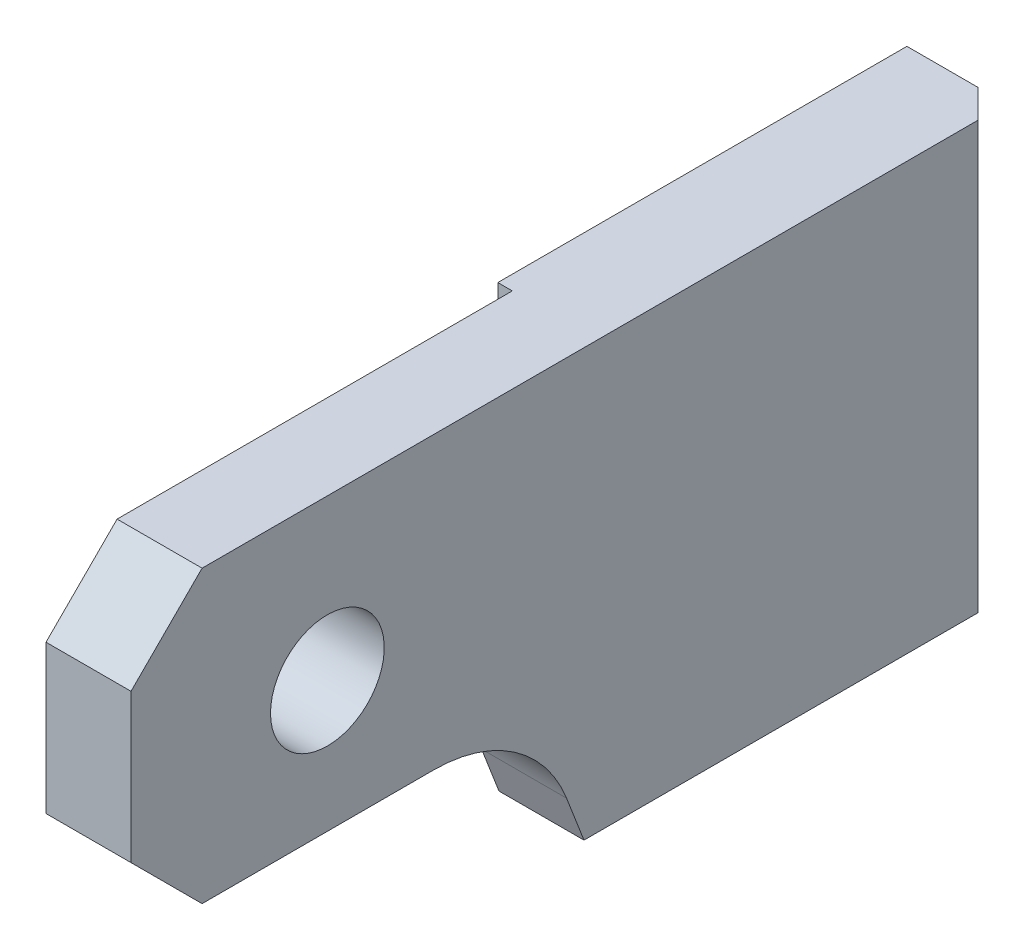
ISO-10303-21;
HEADER;
FILE_DESCRIPTION(('STEP AP214'),'2;1');
FILE_NAME('part.step','',(''),(''),'','','');
FILE_SCHEMA(('AUTOMOTIVE_DESIGN { 1 0 10303 214 1 1 1 1 }'));
ENDSEC;
DATA;
#1=APPLICATION_CONTEXT('core data for automotive mechanical design processes');
#2=APPLICATION_PROTOCOL_DEFINITION('international standard','automotive_design',2000,#1);
#3=PRODUCT_CONTEXT('',#1,'mechanical');
#4=PRODUCT('Part','Part','',(#3));
#5=PRODUCT_RELATED_PRODUCT_CATEGORY('part','',(#4));
#6=PRODUCT_DEFINITION_FORMATION('','',#4);
#7=PRODUCT_DEFINITION_CONTEXT('part definition',#1,'design');
#8=PRODUCT_DEFINITION('design','',#6,#7);
#9=PRODUCT_DEFINITION_SHAPE('','',#8);
#10=(LENGTH_UNIT() NAMED_UNIT(*) SI_UNIT(.MILLI.,.METRE.));
#11=(NAMED_UNIT(*) PLANE_ANGLE_UNIT() SI_UNIT($,.RADIAN.));
#12=(NAMED_UNIT(*) SI_UNIT($,.STERADIAN.) SOLID_ANGLE_UNIT());
#13=UNCERTAINTY_MEASURE_WITH_UNIT(LENGTH_MEASURE(1.E-05),#10,'distance_accuracy_value','');
#14=(GEOMETRIC_REPRESENTATION_CONTEXT(3) GLOBAL_UNCERTAINTY_ASSIGNED_CONTEXT((#13)) GLOBAL_UNIT_ASSIGNED_CONTEXT((#10,
#11,#12)) REPRESENTATION_CONTEXT('',''));
#15=CARTESIAN_POINT('',(0.,0.,0.));
#16=DIRECTION('',(0.,0.,1.));
#17=DIRECTION('',(1.,0.,0.));
#18=AXIS2_PLACEMENT_3D('',#15,#16,#17);
#19=CARTESIAN_POINT('',(-7.,-0.888409732677494,-92.5393309223954));
#20=DIRECTION('',(0.,0.,-1.));
#21=DIRECTION('',(-1.,0.,0.));
#22=AXIS2_PLACEMENT_3D('',#19,#20,#21);
#23=PLANE('',#22);
#24=DIRECTION('',(1.,0.,0.));
#25=VECTOR('',#24,1.);
#26=CARTESIAN_POINT('',(-7.,-0.888409732677494,-92.5393309223954));
#27=LINE('',#26,#25);
#28=CARTESIAN_POINT('',(-7.,-0.888409732677494,-92.5393309223954));
#29=VERTEX_POINT('',#28);
#30=CARTESIAN_POINT('',(-2.00000000000001,-0.888409732677494,-92.5393309223954));
#31=VERTEX_POINT('',#30);
#32=EDGE_CURVE('E173',#29,#31,#27,.T.);
#33=ORIENTED_EDGE('',*,*,#32,.T.);
#34=DIRECTION('',(0.,-1.,0.));
#35=VECTOR('',#34,1.);
#36=CARTESIAN_POINT('',(-2.00000000000001,-30.896809381829,-92.5393309223954));
#37=LINE('',#36,#35);
#38=CARTESIAN_POINT('',(-2.,-30.896809381829,-92.5393309223954));
#39=VERTEX_POINT('',#38);
#40=EDGE_CURVE('E54',#31,#39,#37,.T.);
#41=ORIENTED_EDGE('',*,*,#40,.T.);
#42=DIRECTION('',(1.,0.,0.));
#43=VECTOR('',#42,1.);
#44=CARTESIAN_POINT('',(-7.,-30.896809381829,-92.5393309223954));
#45=LINE('',#44,#43);
#46=CARTESIAN_POINT('',(-7.,-30.896809381829,-92.5393309223954));
#47=VERTEX_POINT('',#46);
#48=EDGE_CURVE('E187',#47,#39,#45,.T.);
#49=ORIENTED_EDGE('',*,*,#48,.F.);
#50=DIRECTION('',(0.,1.,0.));
#51=VECTOR('',#50,1.);
#52=CARTESIAN_POINT('',(-7.,-0.888409732677494,-92.5393309223954));
#53=LINE('',#52,#51);
#54=EDGE_CURVE('E164',#47,#29,#53,.T.);
#55=ORIENTED_EDGE('',*,*,#54,.T.);
#56=EDGE_LOOP('',(#33,#41,#49,#55));
#57=FACE_BOUND('',#56,.T.);
#58=ADVANCED_FACE('F31',(#57),#23,.T.);
#59=CARTESIAN_POINT('',(-7.,-30.8913234542866,-62.8226559338242));
#60=DIRECTION('',(0.,-0.999999982959996,0.00018460771439066));
#61=DIRECTION('',(0.,-0.00018460771439066,-0.999999982959996));
#62=AXIS2_PLACEMENT_3D('',#59,#60,#61);
#63=PLANE('',#62);
#64=DIRECTION('',(0.,0.000184607714390677,0.999999982959996));
#65=VECTOR('',#64,1.);
#66=CARTESIAN_POINT('',(-5.98,-30.8849793695061,-28.4574361847685));
#67=LINE('',#66,#65);
#68=CARTESIAN_POINT('',(-5.98,-30.8914953955952,-63.7540433690182));
#69=VERTEX_POINT('',#68);
#70=CARTESIAN_POINT('',(-5.98,-30.8913234542866,-62.8226559338242));
#71=VERTEX_POINT('',#70);
#72=EDGE_CURVE('E130',#69,#71,#67,.T.);
#73=ORIENTED_EDGE('',*,*,#72,.F.);
#74=DIRECTION('',(1.,0.,0.));
#75=VECTOR('',#74,1.);
#76=CARTESIAN_POINT('',(-13.2889218482286,-30.8914953955952,-63.7540433690182));
#77=LINE('',#76,#75);
#78=CARTESIAN_POINT('',(-7.,-30.8914953955952,-63.7540433690182));
#79=VERTEX_POINT('',#78);
#80=EDGE_CURVE('E121',#79,#69,#77,.T.);
#81=ORIENTED_EDGE('',*,*,#80,.F.);
#82=DIRECTION('',(0.,-0.00018460771439066,-0.999999982959996));
#83=VECTOR('',#82,1.);
#84=CARTESIAN_POINT('',(-7.,-30.8913234542866,-62.8226559338242));
#85=LINE('',#84,#83);
#86=EDGE_CURVE('E171',#79,#47,#85,.T.);
#87=ORIENTED_EDGE('',*,*,#86,.T.);
#88=ORIENTED_EDGE('',*,*,#48,.T.);
#89=DIRECTION('',(0.707106775161997,0.000130537367817163,0.707106775161995));
#90=VECTOR('',#89,1.);
#91=CARTESIAN_POINT('',(10.3583377900718,-30.8945279372971,-80.1809931323237));
#92=LINE('',#91,#90);
#93=CARTESIAN_POINT('',(0.,-30.896440166394,-90.5393309223954));
#94=VERTEX_POINT('',#93);
#95=EDGE_CURVE('E39',#39,#94,#92,.T.);
#96=ORIENTED_EDGE('',*,*,#95,.T.);
#97=DIRECTION('',(0.,-0.00018460771439066,-0.999999982959996));
#98=VECTOR('',#97,1.);
#99=CARTESIAN_POINT('',(0.,-30.8913234542866,-62.8226559338242));
#100=LINE('',#99,#98);
#101=CARTESIAN_POINT('',(0.,-30.8913234542866,-62.8226559338242));
#102=VERTEX_POINT('',#101);
#103=EDGE_CURVE('E168',#102,#94,#100,.T.);
#104=ORIENTED_EDGE('',*,*,#103,.F.);
#105=DIRECTION('',(1.,0.,0.));
#106=VECTOR('',#105,1.);
#107=CARTESIAN_POINT('',(-7.,-30.8913234542866,-62.8226559338242));
#108=LINE('',#107,#106);
#109=EDGE_CURVE('E142',#71,#102,#108,.T.);
#110=ORIENTED_EDGE('',*,*,#109,.F.);
#111=EDGE_LOOP('',(#73,#81,#87,#88,#96,#104,#110));
#112=FACE_BOUND('',#111,.T.);
#113=ADVANCED_FACE('F140',(#112),#63,.T.);
#114=CARTESIAN_POINT('',(-7.,-30.8913234542866,-62.8226559338242));
#115=DIRECTION('',(0.,-0.361043997924807,0.932548782403619));
#116=DIRECTION('',(0.,-0.932548782403619,-0.361043997924807));
#117=AXIS2_PLACEMENT_3D('',#114,#115,#116);
#118=PLANE('',#117);
#119=DIRECTION('',(0.,0.932548782403619,0.361043997924807));
#120=VECTOR('',#119,1.);
#121=CARTESIAN_POINT('',(-5.98,-30.8913234542866,-62.8226559338242));
#122=LINE('',#121,#120);
#123=CARTESIAN_POINT('',(-5.98,-27.7172435022713,-61.593784546898));
#124=VERTEX_POINT('',#123);
#125=EDGE_CURVE('E156',#71,#124,#122,.T.);
#126=ORIENTED_EDGE('',*,*,#125,.F.);
#127=ORIENTED_EDGE('',*,*,#109,.T.);
#128=DIRECTION('',(0.,-0.932548782403619,-0.361043997924807));
#129=VECTOR('',#128,1.);
#130=CARTESIAN_POINT('',(0.,-30.8913234542866,-62.8226559338242));
#131=LINE('',#130,#129);
#132=CARTESIAN_POINT('',(0.,-27.7172435022713,-61.593784546898));
#133=VERTEX_POINT('',#132);
#134=EDGE_CURVE('E182',#133,#102,#131,.T.);
#135=ORIENTED_EDGE('',*,*,#134,.F.);
#136=DIRECTION('',(1.,0.,0.));
#137=VECTOR('',#136,1.);
#138=CARTESIAN_POINT('',(-7.,-27.7172435022713,-61.593784546898));
#139=LINE('',#138,#137);
#140=EDGE_CURVE('E193',#133,#124,#139,.F.);
#141=ORIENTED_EDGE('',*,*,#140,.T.);
#142=EDGE_LOOP('',(#126,#127,#135,#141));
#143=FACE_BOUND('',#142,.T.);
#144=ADVANCED_FACE('F236',(#143),#118,.T.);
#145=CARTESIAN_POINT('',(-7.,-21.3276834815193,-59.1200133743844));
#146=DIRECTION('',(0.,-1.,0.));
#147=DIRECTION('',(0.,0.,-1.));
#148=AXIS2_PLACEMENT_3D('',#145,#146,#147);
#149=PLANE('',#148);
#150=DIRECTION('',(0.,0.,1.));
#151=VECTOR('',#150,1.);
#152=CARTESIAN_POINT('',(-5.98,-21.3276834815193,-59.1200133743844));
#153=LINE('',#152,#151);
#154=CARTESIAN_POINT('',(-5.98,-21.3276834815193,-52.2682967228618));
#155=VERTEX_POINT('',#154);
#156=CARTESIAN_POINT('',(-5.98,-21.3276834815193,-35.9567314021821));
#157=VERTEX_POINT('',#156);
#158=EDGE_CURVE('E46',#155,#157,#153,.T.);
#159=ORIENTED_EDGE('',*,*,#158,.F.);
#160=DIRECTION('',(1.,0.,0.));
#161=VECTOR('',#160,1.);
#162=CARTESIAN_POINT('',(0.,-21.3276834815193,-52.2682967228618));
#163=LINE('',#162,#161);
#164=CARTESIAN_POINT('',(0.,-21.3276834815193,-52.2682967228618));
#165=VERTEX_POINT('',#164);
#166=EDGE_CURVE('E189',#155,#165,#163,.T.);
#167=ORIENTED_EDGE('',*,*,#166,.T.);
#168=DIRECTION('',(0.,0.,-1.));
#169=VECTOR('',#168,1.);
#170=CARTESIAN_POINT('',(0.,-21.3276834815193,-59.1200133743844));
#171=LINE('',#170,#169);
#172=CARTESIAN_POINT('',(0.,-21.3276834815193,-35.9567314021821));
#173=VERTEX_POINT('',#172);
#174=EDGE_CURVE('E179',#173,#165,#171,.T.);
#175=ORIENTED_EDGE('',*,*,#174,.F.);
#176=DIRECTION('',(-1.,0.,0.));
#177=VECTOR('',#176,1.);
#178=CARTESIAN_POINT('',(-7.,-21.3276834815193,-35.9567314021821));
#179=LINE('',#178,#177);
#180=EDGE_CURVE('E209',#173,#157,#179,.T.);
#181=ORIENTED_EDGE('',*,*,#180,.T.);
#182=EDGE_LOOP('',(#159,#167,#175,#181));
#183=FACE_BOUND('',#182,.T.);
#184=ADVANCED_FACE('F263',(#183),#149,.T.);
#185=CARTESIAN_POINT('',(-7.,-0.888409732677494,-30.9567314021821));
#186=DIRECTION('',(0.,0.,1.));
#187=DIRECTION('',(1.,0.,0.));
#188=AXIS2_PLACEMENT_3D('',#185,#186,#187);
#189=PLANE('',#188);
#190=DIRECTION('',(0.,1.,0.));
#191=VECTOR('',#190,1.);
#192=CARTESIAN_POINT('',(-5.98,-0.888409732677494,-30.9567314021821));
#193=LINE('',#192,#191);
#194=CARTESIAN_POINT('',(-5.98,-16.3276834815193,-30.9567314021821));
#195=VERTEX_POINT('',#194);
#196=CARTESIAN_POINT('',(-5.98,-5.8884097326775,-30.9567314021821));
#197=VERTEX_POINT('',#196);
#198=EDGE_CURVE('E147',#195,#197,#193,.T.);
#199=ORIENTED_EDGE('',*,*,#198,.F.);
#200=DIRECTION('',(1.,0.,0.));
#201=VECTOR('',#200,1.);
#202=CARTESIAN_POINT('',(-7.,-16.3276834815193,-30.9567314021821));
#203=LINE('',#202,#201);
#204=CARTESIAN_POINT('',(0.,-16.3276834815193,-30.9567314021821));
#205=VERTEX_POINT('',#204);
#206=EDGE_CURVE('E204',#195,#205,#203,.T.);
#207=ORIENTED_EDGE('',*,*,#206,.T.);
#208=DIRECTION('',(0.,-1.,0.));
#209=VECTOR('',#208,1.);
#210=CARTESIAN_POINT('',(0.,-0.888409732677494,-30.9567314021821));
#211=LINE('',#210,#209);
#212=CARTESIAN_POINT('',(0.,-5.8884097326775,-30.9567314021821));
#213=VERTEX_POINT('',#212);
#214=EDGE_CURVE('E176',#213,#205,#211,.T.);
#215=ORIENTED_EDGE('',*,*,#214,.F.);
#216=DIRECTION('',(-1.,0.,0.));
#217=VECTOR('',#216,1.);
#218=CARTESIAN_POINT('',(-7.,-5.8884097326775,-30.9567314021821));
#219=LINE('',#218,#217);
#220=EDGE_CURVE('E206',#213,#197,#219,.T.);
#221=ORIENTED_EDGE('',*,*,#220,.T.);
#222=EDGE_LOOP('',(#199,#207,#215,#221));
#223=FACE_BOUND('',#222,.T.);
#224=ADVANCED_FACE('F280',(#223),#189,.T.);
#225=CARTESIAN_POINT('',(-7.,-0.888409732677494,-92.5393309223954));
#226=DIRECTION('',(0.,1.,0.));
#227=DIRECTION('',(0.,0.,1.));
#228=AXIS2_PLACEMENT_3D('',#225,#226,#227);
#229=PLANE('',#228);
#230=DIRECTION('',(0.,0.,-1.));
#231=VECTOR('',#230,1.);
#232=CARTESIAN_POINT('',(-5.97999999999999,-0.888409732677494,-92.5393309223954));
#233=LINE('',#232,#231);
#234=CARTESIAN_POINT('',(-5.98,-0.88840973267749,-35.9567314021821));
#235=VERTEX_POINT('',#234);
#236=CARTESIAN_POINT('',(-5.98,-0.888409732677494,-63.7595821701815));
#237=VERTEX_POINT('',#236);
#238=EDGE_CURVE('E136',#235,#237,#233,.T.);
#239=ORIENTED_EDGE('',*,*,#238,.F.);
#240=DIRECTION('',(1.,0.,0.));
#241=VECTOR('',#240,1.);
#242=CARTESIAN_POINT('',(-7.,-0.888409732677494,-35.9567314021821));
#243=LINE('',#242,#241);
#244=CARTESIAN_POINT('',(0.,-0.88840973267749,-35.9567314021821));
#245=VERTEX_POINT('',#244);
#246=EDGE_CURVE('E198',#235,#245,#243,.T.);
#247=ORIENTED_EDGE('',*,*,#246,.T.);
#248=DIRECTION('',(0.,0.,1.));
#249=VECTOR('',#248,1.);
#250=CARTESIAN_POINT('',(0.,-0.888409732677494,-92.5393309223954));
#251=LINE('',#250,#249);
#252=CARTESIAN_POINT('',(0.,-0.888409732677494,-90.5393309223954));
#253=VERTEX_POINT('',#252);
#254=EDGE_CURVE('E163',#253,#245,#251,.T.);
#255=ORIENTED_EDGE('',*,*,#254,.F.);
#256=DIRECTION('',(-0.707106781186549,0.,-0.707106781186546));
#257=VECTOR('',#256,1.);
#258=CARTESIAN_POINT('',(-4.50000000000001,-0.888409732677494,-95.0393309223954));
#259=LINE('',#258,#257);
#260=EDGE_CURVE('E215',#253,#31,#259,.T.);
#261=ORIENTED_EDGE('',*,*,#260,.T.);
#262=ORIENTED_EDGE('',*,*,#32,.F.);
#263=DIRECTION('',(0.,0.,1.));
#264=VECTOR('',#263,1.);
#265=CARTESIAN_POINT('',(-7.,-0.888409732677494,-92.5393309223954));
#266=LINE('',#265,#264);
#267=CARTESIAN_POINT('',(-7.,-0.888409732677495,-63.7595821701815));
#268=VERTEX_POINT('',#267);
#269=EDGE_CURVE('E167',#29,#268,#266,.T.);
#270=ORIENTED_EDGE('',*,*,#269,.T.);
#271=DIRECTION('',(-1.,0.,0.));
#272=VECTOR('',#271,1.);
#273=CARTESIAN_POINT('',(-7.,-0.888409732677494,-63.7595821701815));
#274=LINE('',#273,#272);
#275=EDGE_CURVE('E158',#237,#268,#274,.T.);
#276=ORIENTED_EDGE('',*,*,#275,.F.);
#277=EDGE_LOOP('',(#239,#247,#255,#261,#262,#270,#276));
#278=FACE_BOUND('',#277,.T.);
#279=ADVANCED_FACE('F240',(#278),#229,.T.);
#280=CARTESIAN_POINT('',(-7.,-21.3276834815193,-92.5393309223954));
#281=DIRECTION('',(-1.,0.,0.));
#282=DIRECTION('',(0.,0.,1.));
#283=AXIS2_PLACEMENT_3D('',#280,#281,#282);
#284=PLANE('',#283);
#285=DIRECTION('',(0.,-0.999999982959996,0.00018460771439066));
#286=VECTOR('',#285,1.);
#287=CARTESIAN_POINT('',(-7.,-21.3223698214014,-63.7558099034493));
#288=LINE('',#287,#286);
#289=EDGE_CURVE('E11',#268,#79,#288,.T.);
#290=ORIENTED_EDGE('',*,*,#289,.F.);
#291=ORIENTED_EDGE('',*,*,#269,.F.);
#292=ORIENTED_EDGE('',*,*,#54,.F.);
#293=ORIENTED_EDGE('',*,*,#86,.F.);
#294=EDGE_LOOP('',(#290,#291,#292,#293));
#295=FACE_BOUND('',#294,.T.);
#296=ADVANCED_FACE('F286',(#295),#284,.T.);
#297=CARTESIAN_POINT('',(0.,-21.3276834815193,-92.5393309223954));
#298=DIRECTION('',(-1.,0.,0.));
#299=DIRECTION('',(0.,0.,1.));
#300=AXIS2_PLACEMENT_3D('',#297,#298,#299);
#301=PLANE('',#300);
#302=CARTESIAN_POINT('',(0.,-12.131888621872,-44.7702732282682));
#303=DIRECTION('',(-1.,0.,0.));
#304=DIRECTION('',(0.,0.,1.));
#305=AXIS2_PLACEMENT_3D('',#302,#303,#304);
#306=CIRCLE('',#305,3.99999999959404);
#307=CARTESIAN_POINT('',(0.,-12.131888621872,-40.7702732286741));
#308=VERTEX_POINT('',#307);
#309=EDGE_CURVE('E160',#308,#308,#306,.T.);
#310=ORIENTED_EDGE('',*,*,#309,.T.);
#311=EDGE_LOOP('',(#310));
#312=FACE_BOUND('',#311,.T.);
#313=ORIENTED_EDGE('',*,*,#103,.T.);
#314=DIRECTION('',(0.,1.,0.));
#315=VECTOR('',#314,1.);
#316=CARTESIAN_POINT('',(0.,-0.888409732677494,-90.5393309223954));
#317=LINE('',#316,#315);
#318=EDGE_CURVE('E212',#94,#253,#317,.T.);
#319=ORIENTED_EDGE('',*,*,#318,.T.);
#320=ORIENTED_EDGE('',*,*,#254,.T.);
#321=DIRECTION('',(0.,0.707106781186549,-0.707106781186547));
#322=VECTOR('',#321,1.);
#323=CARTESIAN_POINT('',(0.,-0.888409732677494,-35.9567314021821));
#324=LINE('',#323,#322);
#325=EDGE_CURVE('E202',#245,#213,#324,.F.);
#326=ORIENTED_EDGE('',*,*,#325,.T.);
#327=ORIENTED_EDGE('',*,*,#214,.T.);
#328=DIRECTION('',(0.,0.707106781186547,0.707106781186549));
#329=VECTOR('',#328,1.);
#330=CARTESIAN_POINT('',(0.,-16.3276834815193,-30.9567314021821));
#331=LINE('',#330,#329);
#332=EDGE_CURVE('E200',#205,#173,#331,.F.);
#333=ORIENTED_EDGE('',*,*,#332,.T.);
#334=ORIENTED_EDGE('',*,*,#174,.T.);
#335=CARTESIAN_POINT('',(0.,-31.3276834815193,-52.2682967228618));
#336=DIRECTION('',(-1.,0.,0.));
#337=DIRECTION('',(0.,0.,1.));
#338=AXIS2_PLACEMENT_3D('',#335,#336,#337);
#339=CIRCLE('',#338,10.);
#340=EDGE_CURVE('E196',#165,#133,#339,.T.);
#341=ORIENTED_EDGE('',*,*,#340,.T.);
#342=ORIENTED_EDGE('',*,*,#134,.T.);
#343=EDGE_LOOP('',(#313,#319,#320,#326,#327,#333,#334,#341,#342));
#344=FACE_BOUND('',#343,.T.);
#345=ADVANCED_FACE('F246',(#312,#344),#301,.F.);
#346=CARTESIAN_POINT('',(-7.,-31.3276834815193,-52.2682967228618));
#347=DIRECTION('',(-1.,0.,0.));
#348=DIRECTION('',(0.,0.,1.));
#349=AXIS2_PLACEMENT_3D('',#346,#347,#348);
#350=CYLINDRICAL_SURFACE('',#349,10.);
#351=ORIENTED_EDGE('',*,*,#166,.F.);
#352=CARTESIAN_POINT('',(-5.98,-31.3276834815193,-52.2682967228618));
#353=DIRECTION('',(1.,0.,0.));
#354=DIRECTION('',(0.,0.,-1.));
#355=AXIS2_PLACEMENT_3D('',#352,#353,#354);
#356=CIRCLE('',#355,10.);
#357=EDGE_CURVE('E152',#155,#124,#356,.F.);
#358=ORIENTED_EDGE('',*,*,#357,.T.);
#359=ORIENTED_EDGE('',*,*,#140,.F.);
#360=ORIENTED_EDGE('',*,*,#340,.F.);
#361=EDGE_LOOP('',(#351,#358,#359,#360));
#362=FACE_BOUND('',#361,.T.);
#363=ADVANCED_FACE('F242',(#362),#350,.F.);
#364=CARTESIAN_POINT('',(-7.,-0.888409732677494,-35.9567314021821));
#365=DIRECTION('',(0.,-0.707106781186546,-0.707106781186548));
#366=DIRECTION('',(0.,0.707106781186549,-0.707106781186547));
#367=AXIS2_PLACEMENT_3D('',#364,#365,#366);
#368=PLANE('',#367);
#369=DIRECTION('',(0.,-0.707106781186549,0.707106781186547));
#370=VECTOR('',#369,1.);
#371=CARTESIAN_POINT('',(-5.98,-0.888409732677494,-35.9567314021821));
#372=LINE('',#371,#370);
#373=EDGE_CURVE('E150',#197,#235,#372,.F.);
#374=ORIENTED_EDGE('',*,*,#373,.F.);
#375=ORIENTED_EDGE('',*,*,#220,.F.);
#376=ORIENTED_EDGE('',*,*,#325,.F.);
#377=ORIENTED_EDGE('',*,*,#246,.F.);
#378=EDGE_LOOP('',(#374,#375,#376,#377));
#379=FACE_BOUND('',#378,.T.);
#380=ADVANCED_FACE('F245',(#379),#368,.F.);
#381=CARTESIAN_POINT('',(-7.,-16.3276834815193,-30.9567314021821));
#382=DIRECTION('',(0.,0.707106781186548,-0.707106781186546));
#383=DIRECTION('',(0.,0.707106781186547,0.707106781186549));
#384=AXIS2_PLACEMENT_3D('',#381,#382,#383);
#385=PLANE('',#384);
#386=DIRECTION('',(0.,-0.707106781186547,-0.707106781186549));
#387=VECTOR('',#386,1.);
#388=CARTESIAN_POINT('',(-5.98,-16.3276834815193,-30.9567314021821));
#389=LINE('',#388,#387);
#390=EDGE_CURVE('E145',#157,#195,#389,.F.);
#391=ORIENTED_EDGE('',*,*,#390,.F.);
#392=ORIENTED_EDGE('',*,*,#180,.F.);
#393=ORIENTED_EDGE('',*,*,#332,.F.);
#394=ORIENTED_EDGE('',*,*,#206,.F.);
#395=EDGE_LOOP('',(#391,#392,#393,#394));
#396=FACE_BOUND('',#395,.T.);
#397=ADVANCED_FACE('F249',(#396),#385,.F.);
#398=CARTESIAN_POINT('',(0.,-21.3276834815193,-90.5393309223954));
#399=DIRECTION('',(0.707106781186546,0.,-0.707106781186549));
#400=DIRECTION('',(-0.707106781186549,0.,-0.707106781186546));
#401=AXIS2_PLACEMENT_3D('',#398,#399,#400);
#402=PLANE('',#401);
#403=ORIENTED_EDGE('',*,*,#95,.F.);
#404=ORIENTED_EDGE('',*,*,#40,.F.);
#405=ORIENTED_EDGE('',*,*,#260,.F.);
#406=ORIENTED_EDGE('',*,*,#318,.F.);
#407=EDGE_LOOP('',(#403,#404,#405,#406));
#408=FACE_BOUND('',#407,.T.);
#409=ADVANCED_FACE('F33',(#408),#402,.T.);
#410=CARTESIAN_POINT('',(0.,-12.131888621872,-44.7702732282682));
#411=DIRECTION('',(-1.,0.,0.));
#412=DIRECTION('',(0.,0.,1.));
#413=AXIS2_PLACEMENT_3D('',#410,#411,#412);
#414=CYLINDRICAL_SURFACE('',#413,3.99999999959404);
#415=CARTESIAN_POINT('',(-5.98,-12.131888621872,-44.7702732282682));
#416=DIRECTION('',(1.,0.,0.));
#417=DIRECTION('',(0.,0.,-1.));
#418=AXIS2_PLACEMENT_3D('',#415,#416,#417);
#419=CIRCLE('',#418,3.99999999959404);
#420=CARTESIAN_POINT('',(-5.98,-12.131888621872,-48.7702732278622));
#421=VERTEX_POINT('',#420);
#422=EDGE_CURVE('E137',#421,#421,#419,.F.);
#423=ORIENTED_EDGE('',*,*,#422,.T.);
#424=EDGE_LOOP('',(#423));
#425=FACE_BOUND('',#424,.T.);
#426=ORIENTED_EDGE('',*,*,#309,.F.);
#427=EDGE_LOOP('',(#426));
#428=FACE_BOUND('',#427,.T.);
#429=ADVANCED_FACE('F221',(#425,#428),#414,.F.);
#430=CARTESIAN_POINT('',(-5.98,-0.876580743041078,-28.4629759667458));
#431=DIRECTION('',(1.,0.,0.));
#432=DIRECTION('',(0.,0.,-1.));
#433=AXIS2_PLACEMENT_3D('',#430,#431,#432);
#434=PLANE('',#433);
#435=ORIENTED_EDGE('',*,*,#125,.T.);
#436=ORIENTED_EDGE('',*,*,#357,.F.);
#437=ORIENTED_EDGE('',*,*,#158,.T.);
#438=ORIENTED_EDGE('',*,*,#390,.T.);
#439=ORIENTED_EDGE('',*,*,#198,.T.);
#440=ORIENTED_EDGE('',*,*,#373,.T.);
#441=ORIENTED_EDGE('',*,*,#238,.T.);
#442=DIRECTION('',(0.,-0.999999982959996,0.00018460771439066));
#443=VECTOR('',#442,1.);
#444=CARTESIAN_POINT('',(-5.98,-0.883096769130141,-63.7595831509955));
#445=LINE('',#444,#443);
#446=EDGE_CURVE('E124',#237,#69,#445,.T.);
#447=ORIENTED_EDGE('',*,*,#446,.T.);
#448=ORIENTED_EDGE('',*,*,#72,.T.);
#449=EDGE_LOOP('',(#435,#436,#437,#438,#439,#440,#441,#447,#448));
#450=FACE_BOUND('',#449,.T.);
#451=ORIENTED_EDGE('',*,*,#422,.F.);
#452=EDGE_LOOP('',(#451));
#453=FACE_BOUND('',#452,.T.);
#454=ADVANCED_FACE('F132',(#450,#453),#434,.F.);
#455=CARTESIAN_POINT('',(-13.2889218482286,-0.883096769130141,-63.7595831509955));
#456=DIRECTION('',(0.,-0.00018460771439066,-0.999999982959996));
#457=DIRECTION('',(0.,0.999999982959996,-0.00018460771439066));
#458=AXIS2_PLACEMENT_3D('',#455,#456,#457);
#459=PLANE('',#458);
#460=ORIENTED_EDGE('',*,*,#275,.T.);
#461=ORIENTED_EDGE('',*,*,#289,.T.);
#462=ORIENTED_EDGE('',*,*,#80,.T.);
#463=ORIENTED_EDGE('',*,*,#446,.F.);
#464=EDGE_LOOP('',(#460,#461,#462,#463));
#465=FACE_BOUND('',#464,.T.);
#466=ADVANCED_FACE('F123',(#465),#459,.F.);
#467=CLOSED_SHELL('',(#58,#113,#144,#184,#224,#279,#296,#345,#363,#380,#397,#409,#429,#454,#466));
#468=MANIFOLD_SOLID_BREP('B2',#467);
#469=ADVANCED_BREP_SHAPE_REPRESENTATION('',(#18,#468),#14);
#470=SHAPE_DEFINITION_REPRESENTATION(#9,#469);
ENDSEC;
END-ISO-10303-21;
